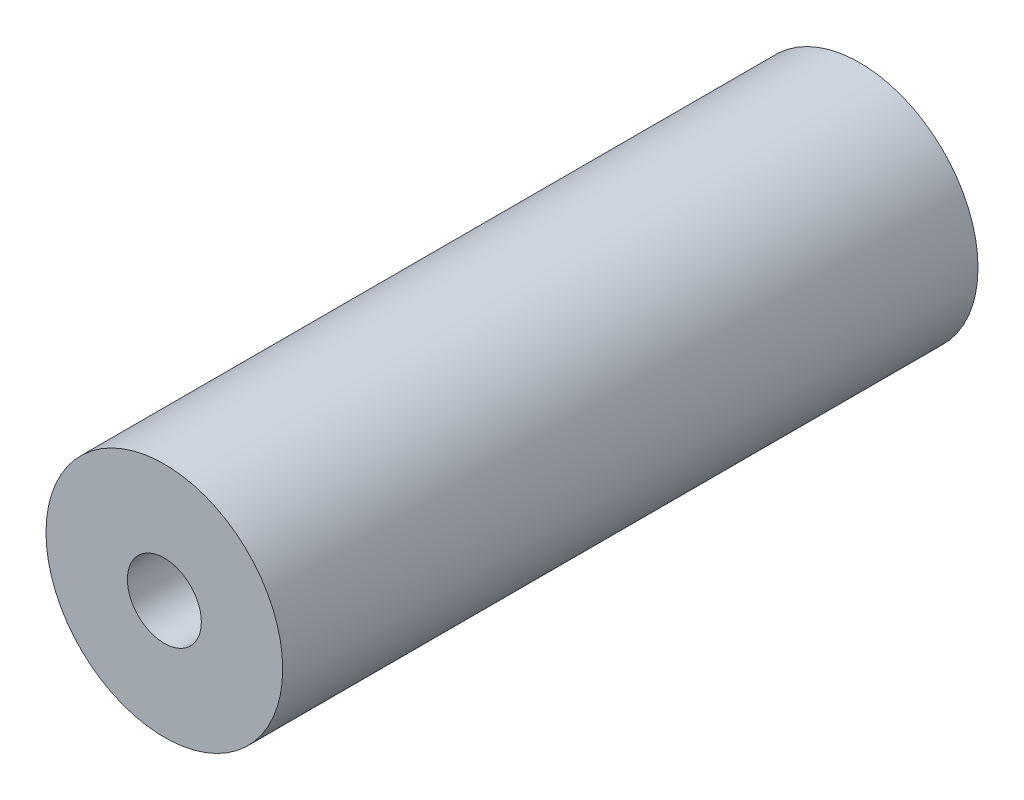
ISO-10303-21;
HEADER;
FILE_DESCRIPTION(('STEP AP214'),'2;1');
FILE_NAME('part.step','',(''),(''),'','','');
FILE_SCHEMA(('AUTOMOTIVE_DESIGN { 1 0 10303 214 1 1 1 1 }'));
ENDSEC;
DATA;
#1=APPLICATION_CONTEXT('core data for automotive mechanical design processes');
#2=APPLICATION_PROTOCOL_DEFINITION('international standard','automotive_design',2000,#1);
#3=PRODUCT_CONTEXT('',#1,'mechanical');
#4=PRODUCT('Part','Part','',(#3));
#5=PRODUCT_RELATED_PRODUCT_CATEGORY('part','',(#4));
#6=PRODUCT_DEFINITION_FORMATION('','',#4);
#7=PRODUCT_DEFINITION_CONTEXT('part definition',#1,'design');
#8=PRODUCT_DEFINITION('design','',#6,#7);
#9=PRODUCT_DEFINITION_SHAPE('','',#8);
#10=(LENGTH_UNIT() NAMED_UNIT(*) SI_UNIT(.MILLI.,.METRE.));
#11=(NAMED_UNIT(*) PLANE_ANGLE_UNIT() SI_UNIT($,.RADIAN.));
#12=(NAMED_UNIT(*) SI_UNIT($,.STERADIAN.) SOLID_ANGLE_UNIT());
#13=UNCERTAINTY_MEASURE_WITH_UNIT(LENGTH_MEASURE(1.E-05),#10,'distance_accuracy_value','');
#14=(GEOMETRIC_REPRESENTATION_CONTEXT(3) GLOBAL_UNCERTAINTY_ASSIGNED_CONTEXT((#13)) GLOBAL_UNIT_ASSIGNED_CONTEXT((#10,
#11,#12)) REPRESENTATION_CONTEXT('',''));
#15=CARTESIAN_POINT('',(0.,0.,0.));
#16=DIRECTION('',(0.,0.,1.));
#17=DIRECTION('',(1.,0.,0.));
#18=AXIS2_PLACEMENT_3D('',#15,#16,#17);
#19=CARTESIAN_POINT('',(0.,0.254,0.));
#20=DIRECTION('',(0.,0.,-1.));
#21=DIRECTION('',(-1.,0.,0.));
#22=AXIS2_PLACEMENT_3D('',#19,#20,#21);
#23=PLANE('',#22);
#24=CARTESIAN_POINT('',(0.,0.,0.));
#25=DIRECTION('',(0.,0.,1.));
#26=DIRECTION('',(1.,0.,0.));
#27=AXIS2_PLACEMENT_3D('',#24,#25,#26);
#28=CIRCLE('',#27,0.254);
#29=CARTESIAN_POINT('',(0.254,0.,0.));
#30=VERTEX_POINT('',#29);
#31=EDGE_CURVE('E46',#30,#30,#28,.T.);
#32=ORIENTED_EDGE('',*,*,#31,.F.);
#33=EDGE_LOOP('',(#32));
#34=FACE_BOUND('',#33,.T.);
#35=CARTESIAN_POINT('',(0.,0.,0.));
#36=DIRECTION('',(0.,0.,1.));
#37=DIRECTION('',(1.,0.,0.));
#38=AXIS2_PLACEMENT_3D('',#35,#36,#37);
#39=CIRCLE('',#38,0.8128);
#40=CARTESIAN_POINT('',(0.8128,0.,0.));
#41=VERTEX_POINT('',#40);
#42=EDGE_CURVE('E10',#41,#41,#39,.T.);
#43=ORIENTED_EDGE('',*,*,#42,.T.);
#44=EDGE_LOOP('',(#43));
#45=FACE_BOUND('',#44,.T.);
#46=ADVANCED_FACE('F32',(#34,#45),#23,.F.);
#47=CARTESIAN_POINT('',(0.,0.,-4.7752));
#48=DIRECTION('',(0.,0.,1.));
#49=DIRECTION('',(1.,0.,0.));
#50=AXIS2_PLACEMENT_3D('',#47,#48,#49);
#51=CYLINDRICAL_SURFACE('',#50,0.8128);
#52=ORIENTED_EDGE('',*,*,#42,.F.);
#53=EDGE_LOOP('',(#52));
#54=FACE_BOUND('',#53,.T.);
#55=CARTESIAN_POINT('',(0.,0.,-4.7752));
#56=DIRECTION('',(0.,0.,1.));
#57=DIRECTION('',(1.,0.,0.));
#58=AXIS2_PLACEMENT_3D('',#55,#56,#57);
#59=CIRCLE('',#58,0.8128);
#60=CARTESIAN_POINT('',(0.8128,0.,-4.7752));
#61=VERTEX_POINT('',#60);
#62=EDGE_CURVE('E38',#61,#61,#59,.T.);
#63=ORIENTED_EDGE('',*,*,#62,.T.);
#64=EDGE_LOOP('',(#63));
#65=FACE_BOUND('',#64,.T.);
#66=ADVANCED_FACE('F55',(#54,#65),#51,.T.);
#67=CARTESIAN_POINT('',(0.,0.8128,-4.7752));
#68=DIRECTION('',(0.,0.,1.));
#69=DIRECTION('',(1.,0.,0.));
#70=AXIS2_PLACEMENT_3D('',#67,#68,#69);
#71=PLANE('',#70);
#72=ORIENTED_EDGE('',*,*,#62,.F.);
#73=EDGE_LOOP('',(#72));
#74=FACE_BOUND('',#73,.T.);
#75=CARTESIAN_POINT('',(0.,0.,-4.7752));
#76=DIRECTION('',(0.,0.,1.));
#77=DIRECTION('',(1.,0.,0.));
#78=AXIS2_PLACEMENT_3D('',#75,#76,#77);
#79=CIRCLE('',#78,0.254);
#80=CARTESIAN_POINT('',(0.254,0.,-4.7752));
#81=VERTEX_POINT('',#80);
#82=EDGE_CURVE('E42',#81,#81,#79,.T.);
#83=ORIENTED_EDGE('',*,*,#82,.T.);
#84=EDGE_LOOP('',(#83));
#85=FACE_BOUND('',#84,.T.);
#86=ADVANCED_FACE('F59',(#74,#85),#71,.F.);
#87=CARTESIAN_POINT('',(0.,0.,-4.7752));
#88=DIRECTION('',(0.,0.,1.));
#89=DIRECTION('',(1.,0.,0.));
#90=AXIS2_PLACEMENT_3D('',#87,#88,#89);
#91=CYLINDRICAL_SURFACE('',#90,0.254);
#92=ORIENTED_EDGE('',*,*,#82,.F.);
#93=EDGE_LOOP('',(#92));
#94=FACE_BOUND('',#93,.T.);
#95=ORIENTED_EDGE('',*,*,#31,.T.);
#96=EDGE_LOOP('',(#95));
#97=FACE_BOUND('',#96,.T.);
#98=ADVANCED_FACE('F52',(#94,#97),#91,.F.);
#99=CLOSED_SHELL('',(#46,#66,#86,#98));
#100=MANIFOLD_SOLID_BREP('B2',#99);
#101=ADVANCED_BREP_SHAPE_REPRESENTATION('',(#18,#100),#14);
#102=SHAPE_DEFINITION_REPRESENTATION(#9,#101);
ENDSEC;
END-ISO-10303-21;
